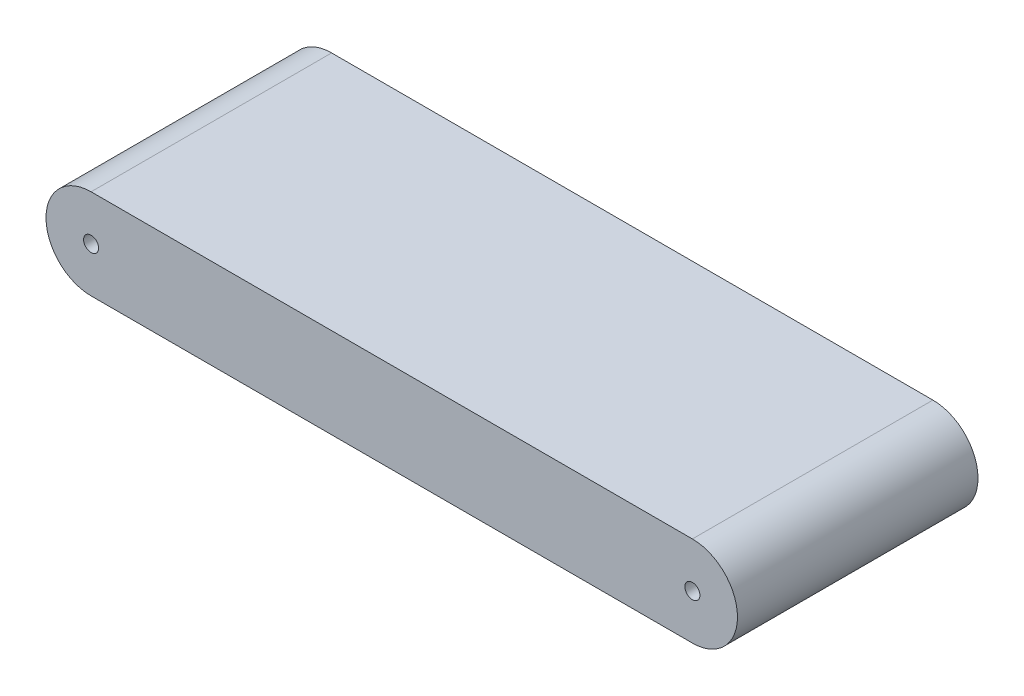
ISO-10303-21;
HEADER;
FILE_DESCRIPTION(('STEP AP214'),'2;1');
FILE_NAME('part.step','',(''),(''),'','','');
FILE_SCHEMA(('AUTOMOTIVE_DESIGN { 1 0 10303 214 1 1 1 1 }'));
ENDSEC;
DATA;
#1=APPLICATION_CONTEXT('core data for automotive mechanical design processes');
#2=APPLICATION_PROTOCOL_DEFINITION('international standard','automotive_design',2000,#1);
#3=PRODUCT_CONTEXT('',#1,'mechanical');
#4=PRODUCT('Part','Part','',(#3));
#5=PRODUCT_RELATED_PRODUCT_CATEGORY('part','',(#4));
#6=PRODUCT_DEFINITION_FORMATION('','',#4);
#7=PRODUCT_DEFINITION_CONTEXT('part definition',#1,'design');
#8=PRODUCT_DEFINITION('design','',#6,#7);
#9=PRODUCT_DEFINITION_SHAPE('','',#8);
#10=(LENGTH_UNIT() NAMED_UNIT(*) SI_UNIT(.MILLI.,.METRE.));
#11=(NAMED_UNIT(*) PLANE_ANGLE_UNIT() SI_UNIT($,.RADIAN.));
#12=(NAMED_UNIT(*) SI_UNIT($,.STERADIAN.) SOLID_ANGLE_UNIT());
#13=UNCERTAINTY_MEASURE_WITH_UNIT(LENGTH_MEASURE(1.E-05),#10,'distance_accuracy_value','');
#14=(GEOMETRIC_REPRESENTATION_CONTEXT(3) GLOBAL_UNCERTAINTY_ASSIGNED_CONTEXT((#13)) GLOBAL_UNIT_ASSIGNED_CONTEXT((#10,
#11,#12)) REPRESENTATION_CONTEXT('',''));
#15=CARTESIAN_POINT('',(0.,0.,0.));
#16=DIRECTION('',(0.,0.,1.));
#17=DIRECTION('',(1.,0.,0.));
#18=AXIS2_PLACEMENT_3D('',#15,#16,#17);
#19=CARTESIAN_POINT('',(-100.,0.,80.));
#20=DIRECTION('',(0.,0.,-1.));
#21=DIRECTION('',(-1.,0.,0.));
#22=AXIS2_PLACEMENT_3D('',#19,#20,#21);
#23=CYLINDRICAL_SURFACE('',#22,15.);
#24=CARTESIAN_POINT('',(-100.,0.,0.));
#25=DIRECTION('',(0.,0.,1.));
#26=DIRECTION('',(1.,0.,0.));
#27=AXIS2_PLACEMENT_3D('',#24,#25,#26);
#28=CIRCLE('',#27,15.);
#29=CARTESIAN_POINT('',(-100.,15.,0.));
#30=VERTEX_POINT('',#29);
#31=CARTESIAN_POINT('',(-100.,-15.,0.));
#32=VERTEX_POINT('',#31);
#33=EDGE_CURVE('E102',#30,#32,#28,.T.);
#34=ORIENTED_EDGE('',*,*,#33,.T.);
#35=DIRECTION('',(0.,0.,-1.));
#36=VECTOR('',#35,1.);
#37=CARTESIAN_POINT('',(-100.,-15.,80.));
#38=LINE('',#37,#36);
#39=CARTESIAN_POINT('',(-100.,-15.,80.));
#40=VERTEX_POINT('',#39);
#41=EDGE_CURVE('E11',#40,#32,#38,.T.);
#42=ORIENTED_EDGE('',*,*,#41,.F.);
#43=CARTESIAN_POINT('',(-100.,0.,80.));
#44=DIRECTION('',(0.,0.,1.));
#45=DIRECTION('',(1.,0.,0.));
#46=AXIS2_PLACEMENT_3D('',#43,#44,#45);
#47=CIRCLE('',#46,15.);
#48=CARTESIAN_POINT('',(-100.,15.,80.));
#49=VERTEX_POINT('',#48);
#50=EDGE_CURVE('E90',#49,#40,#47,.T.);
#51=ORIENTED_EDGE('',*,*,#50,.F.);
#52=DIRECTION('',(0.,0.,-1.));
#53=VECTOR('',#52,1.);
#54=CARTESIAN_POINT('',(-100.,15.,80.));
#55=LINE('',#54,#53);
#56=EDGE_CURVE('E98',#49,#30,#55,.T.);
#57=ORIENTED_EDGE('',*,*,#56,.T.);
#58=EDGE_LOOP('',(#34,#42,#51,#57));
#59=FACE_BOUND('',#58,.T.);
#60=ADVANCED_FACE('F39',(#59),#23,.T.);
#61=CARTESIAN_POINT('',(-100.,-15.,80.));
#62=DIRECTION('',(0.,1.,0.));
#63=DIRECTION('',(-1.,0.,0.));
#64=AXIS2_PLACEMENT_3D('',#61,#62,#63);
#65=PLANE('',#64);
#66=DIRECTION('',(1.,0.,0.));
#67=VECTOR('',#66,1.);
#68=CARTESIAN_POINT('',(-100.,-15.,0.));
#69=LINE('',#68,#67);
#70=CARTESIAN_POINT('',(100.,-15.,0.));
#71=VERTEX_POINT('',#70);
#72=EDGE_CURVE('E94',#32,#71,#69,.T.);
#73=ORIENTED_EDGE('',*,*,#72,.T.);
#74=DIRECTION('',(0.,0.,-1.));
#75=VECTOR('',#74,1.);
#76=CARTESIAN_POINT('',(100.,-15.,80.));
#77=LINE('',#76,#75);
#78=CARTESIAN_POINT('',(100.,-15.,80.));
#79=VERTEX_POINT('',#78);
#80=EDGE_CURVE('E47',#79,#71,#77,.T.);
#81=ORIENTED_EDGE('',*,*,#80,.F.);
#82=DIRECTION('',(1.,0.,0.));
#83=VECTOR('',#82,1.);
#84=CARTESIAN_POINT('',(-100.,-15.,80.));
#85=LINE('',#84,#83);
#86=EDGE_CURVE('E85',#40,#79,#85,.T.);
#87=ORIENTED_EDGE('',*,*,#86,.F.);
#88=ORIENTED_EDGE('',*,*,#41,.T.);
#89=EDGE_LOOP('',(#73,#81,#87,#88));
#90=FACE_BOUND('',#89,.T.);
#91=ADVANCED_FACE('F93',(#90),#65,.F.);
#92=CARTESIAN_POINT('',(100.,0.,80.));
#93=DIRECTION('',(0.,0.,-1.));
#94=DIRECTION('',(-1.,0.,0.));
#95=AXIS2_PLACEMENT_3D('',#92,#93,#94);
#96=CYLINDRICAL_SURFACE('',#95,15.);
#97=CARTESIAN_POINT('',(100.,0.,0.));
#98=DIRECTION('',(0.,0.,1.));
#99=DIRECTION('',(1.,0.,0.));
#100=AXIS2_PLACEMENT_3D('',#97,#98,#99);
#101=CIRCLE('',#100,15.);
#102=CARTESIAN_POINT('',(100.,15.,0.));
#103=VERTEX_POINT('',#102);
#104=EDGE_CURVE('E72',#71,#103,#101,.T.);
#105=ORIENTED_EDGE('',*,*,#104,.T.);
#106=DIRECTION('',(0.,0.,-1.));
#107=VECTOR('',#106,1.);
#108=CARTESIAN_POINT('',(100.,15.,80.));
#109=LINE('',#108,#107);
#110=CARTESIAN_POINT('',(100.,15.,80.));
#111=VERTEX_POINT('',#110);
#112=EDGE_CURVE('E95',#111,#103,#109,.T.);
#113=ORIENTED_EDGE('',*,*,#112,.F.);
#114=CARTESIAN_POINT('',(100.,0.,80.));
#115=DIRECTION('',(0.,0.,1.));
#116=DIRECTION('',(1.,0.,0.));
#117=AXIS2_PLACEMENT_3D('',#114,#115,#116);
#118=CIRCLE('',#117,15.);
#119=EDGE_CURVE('E88',#79,#111,#118,.T.);
#120=ORIENTED_EDGE('',*,*,#119,.F.);
#121=ORIENTED_EDGE('',*,*,#80,.T.);
#122=EDGE_LOOP('',(#105,#113,#120,#121));
#123=FACE_BOUND('',#122,.T.);
#124=ADVANCED_FACE('F96',(#123),#96,.T.);
#125=CARTESIAN_POINT('',(-100.,15.,80.));
#126=DIRECTION('',(0.,-1.,0.));
#127=DIRECTION('',(1.,0.,0.));
#128=AXIS2_PLACEMENT_3D('',#125,#126,#127);
#129=PLANE('',#128);
#130=DIRECTION('',(-1.,0.,0.));
#131=VECTOR('',#130,1.);
#132=CARTESIAN_POINT('',(-100.,15.,0.));
#133=LINE('',#132,#131);
#134=EDGE_CURVE('E78',#103,#30,#133,.T.);
#135=ORIENTED_EDGE('',*,*,#134,.T.);
#136=ORIENTED_EDGE('',*,*,#56,.F.);
#137=DIRECTION('',(-1.,0.,0.));
#138=VECTOR('',#137,1.);
#139=CARTESIAN_POINT('',(-100.,15.,80.));
#140=LINE('',#139,#138);
#141=EDGE_CURVE('E55',#111,#49,#140,.T.);
#142=ORIENTED_EDGE('',*,*,#141,.F.);
#143=ORIENTED_EDGE('',*,*,#112,.T.);
#144=EDGE_LOOP('',(#135,#136,#142,#143));
#145=FACE_BOUND('',#144,.T.);
#146=ADVANCED_FACE('F110',(#145),#129,.F.);
#147=CARTESIAN_POINT('',(-100.,0.,80.));
#148=DIRECTION('',(0.,0.,1.));
#149=DIRECTION('',(1.,0.,0.));
#150=AXIS2_PLACEMENT_3D('',#147,#148,#149);
#151=PLANE('',#150);
#152=CARTESIAN_POINT('',(-100.,0.,80.));
#153=DIRECTION('',(0.,0.,1.));
#154=DIRECTION('',(1.,0.,0.));
#155=AXIS2_PLACEMENT_3D('',#152,#153,#154);
#156=CIRCLE('',#155,2.5);
#157=CARTESIAN_POINT('',(-97.5,0.,80.));
#158=VERTEX_POINT('',#157);
#159=EDGE_CURVE('E105',#158,#158,#156,.T.);
#160=ORIENTED_EDGE('',*,*,#159,.F.);
#161=EDGE_LOOP('',(#160));
#162=FACE_BOUND('',#161,.T.);
#163=CARTESIAN_POINT('',(100.,0.,80.));
#164=DIRECTION('',(0.,0.,1.));
#165=DIRECTION('',(1.,0.,0.));
#166=AXIS2_PLACEMENT_3D('',#163,#164,#165);
#167=CIRCLE('',#166,2.5);
#168=CARTESIAN_POINT('',(102.5,0.,80.));
#169=VERTEX_POINT('',#168);
#170=EDGE_CURVE('E118',#169,#169,#167,.T.);
#171=ORIENTED_EDGE('',*,*,#170,.F.);
#172=EDGE_LOOP('',(#171));
#173=FACE_BOUND('',#172,.T.);
#174=ORIENTED_EDGE('',*,*,#50,.T.);
#175=ORIENTED_EDGE('',*,*,#86,.T.);
#176=ORIENTED_EDGE('',*,*,#119,.T.);
#177=ORIENTED_EDGE('',*,*,#141,.T.);
#178=EDGE_LOOP('',(#174,#175,#176,#177));
#179=FACE_BOUND('',#178,.T.);
#180=ADVANCED_FACE('F86',(#162,#173,#179),#151,.T.);
#181=CARTESIAN_POINT('',(-100.,0.,0.));
#182=DIRECTION('',(0.,0.,1.));
#183=DIRECTION('',(1.,0.,0.));
#184=AXIS2_PLACEMENT_3D('',#181,#182,#183);
#185=PLANE('',#184);
#186=CARTESIAN_POINT('',(-100.,0.,0.));
#187=DIRECTION('',(0.,0.,1.));
#188=DIRECTION('',(1.,0.,0.));
#189=AXIS2_PLACEMENT_3D('',#186,#187,#188);
#190=CIRCLE('',#189,2.5);
#191=CARTESIAN_POINT('',(-97.5,0.,0.));
#192=VERTEX_POINT('',#191);
#193=EDGE_CURVE('E121',#192,#192,#190,.T.);
#194=ORIENTED_EDGE('',*,*,#193,.T.);
#195=EDGE_LOOP('',(#194));
#196=FACE_BOUND('',#195,.T.);
#197=CARTESIAN_POINT('',(100.,0.,0.));
#198=DIRECTION('',(0.,0.,1.));
#199=DIRECTION('',(1.,0.,0.));
#200=AXIS2_PLACEMENT_3D('',#197,#198,#199);
#201=CIRCLE('',#200,2.5);
#202=CARTESIAN_POINT('',(102.5,0.,0.));
#203=VERTEX_POINT('',#202);
#204=EDGE_CURVE('E122',#203,#203,#201,.T.);
#205=ORIENTED_EDGE('',*,*,#204,.T.);
#206=EDGE_LOOP('',(#205));
#207=FACE_BOUND('',#206,.T.);
#208=ORIENTED_EDGE('',*,*,#33,.F.);
#209=ORIENTED_EDGE('',*,*,#134,.F.);
#210=ORIENTED_EDGE('',*,*,#104,.F.);
#211=ORIENTED_EDGE('',*,*,#72,.F.);
#212=EDGE_LOOP('',(#208,#209,#210,#211));
#213=FACE_BOUND('',#212,.T.);
#214=ADVANCED_FACE('F113',(#196,#207,#213),#185,.F.);
#215=CARTESIAN_POINT('',(100.,0.,0.));
#216=DIRECTION('',(0.,0.,1.));
#217=DIRECTION('',(1.,0.,0.));
#218=AXIS2_PLACEMENT_3D('',#215,#216,#217);
#219=CYLINDRICAL_SURFACE('',#218,2.5);
#220=ORIENTED_EDGE('',*,*,#170,.T.);
#221=EDGE_LOOP('',(#220));
#222=FACE_BOUND('',#221,.T.);
#223=ORIENTED_EDGE('',*,*,#204,.F.);
#224=EDGE_LOOP('',(#223));
#225=FACE_BOUND('',#224,.T.);
#226=ADVANCED_FACE('F132',(#222,#225),#219,.F.);
#227=CARTESIAN_POINT('',(-100.,0.,0.));
#228=DIRECTION('',(0.,0.,1.));
#229=DIRECTION('',(1.,0.,0.));
#230=AXIS2_PLACEMENT_3D('',#227,#228,#229);
#231=CYLINDRICAL_SURFACE('',#230,2.5);
#232=ORIENTED_EDGE('',*,*,#159,.T.);
#233=EDGE_LOOP('',(#232));
#234=FACE_BOUND('',#233,.T.);
#235=ORIENTED_EDGE('',*,*,#193,.F.);
#236=EDGE_LOOP('',(#235));
#237=FACE_BOUND('',#236,.T.);
#238=ADVANCED_FACE('F130',(#234,#237),#231,.F.);
#239=CLOSED_SHELL('',(#60,#91,#124,#146,#180,#214,#226,#238));
#240=MANIFOLD_SOLID_BREP('B2',#239);
#241=ADVANCED_BREP_SHAPE_REPRESENTATION('',(#18,#240),#14);
#242=SHAPE_DEFINITION_REPRESENTATION(#9,#241);
ENDSEC;
END-ISO-10303-21;
